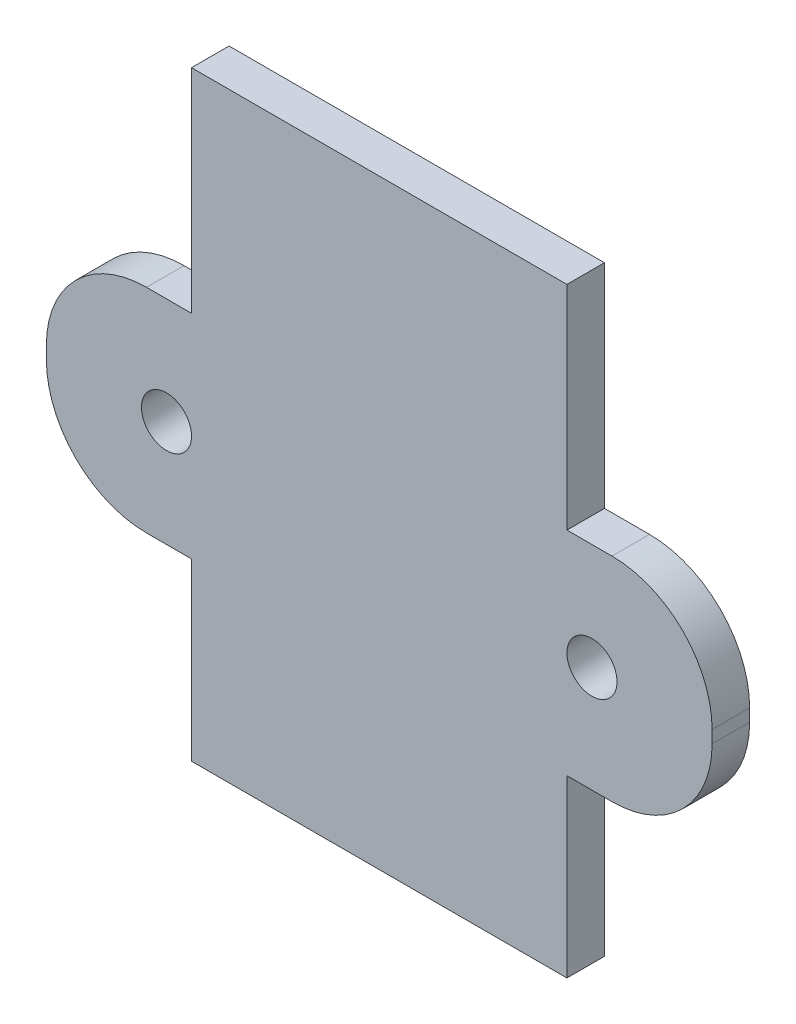
ISO-10303-21;
HEADER;
FILE_DESCRIPTION(('STEP AP214'),'2;1');
FILE_NAME('part.step','',(''),(''),'','','');
FILE_SCHEMA(('AUTOMOTIVE_DESIGN { 1 0 10303 214 1 1 1 1 }'));
ENDSEC;
DATA;
#1=APPLICATION_CONTEXT('core data for automotive mechanical design processes');
#2=APPLICATION_PROTOCOL_DEFINITION('international standard','automotive_design',2000,#1);
#3=PRODUCT_CONTEXT('',#1,'mechanical');
#4=PRODUCT('Part','Part','',(#3));
#5=PRODUCT_RELATED_PRODUCT_CATEGORY('part','',(#4));
#6=PRODUCT_DEFINITION_FORMATION('','',#4);
#7=PRODUCT_DEFINITION_CONTEXT('part definition',#1,'design');
#8=PRODUCT_DEFINITION('design','',#6,#7);
#9=PRODUCT_DEFINITION_SHAPE('','',#8);
#10=(LENGTH_UNIT() NAMED_UNIT(*) SI_UNIT(.MILLI.,.METRE.));
#11=(NAMED_UNIT(*) PLANE_ANGLE_UNIT() SI_UNIT($,.RADIAN.));
#12=(NAMED_UNIT(*) SI_UNIT($,.STERADIAN.) SOLID_ANGLE_UNIT());
#13=UNCERTAINTY_MEASURE_WITH_UNIT(LENGTH_MEASURE(1.E-05),#10,'distance_accuracy_value','');
#14=(GEOMETRIC_REPRESENTATION_CONTEXT(3) GLOBAL_UNCERTAINTY_ASSIGNED_CONTEXT((#13)) GLOBAL_UNIT_ASSIGNED_CONTEXT((#10,
#11,#12)) REPRESENTATION_CONTEXT('',''));
#15=CARTESIAN_POINT('',(0.,0.,0.));
#16=DIRECTION('',(0.,0.,1.));
#17=DIRECTION('',(1.,0.,0.));
#18=AXIS2_PLACEMENT_3D('',#15,#16,#17);
#19=CARTESIAN_POINT('',(-23.838175931887,-1.04784341461353,1.5));
#20=DIRECTION('',(0.,0.,-1.));
#21=DIRECTION('',(-1.,0.,0.));
#22=AXIS2_PLACEMENT_3D('',#19,#20,#21);
#23=CYLINDRICAL_SURFACE('',#22,4.);
#24=CARTESIAN_POINT('',(-23.838175931887,-1.04784341461353,0.));
#25=DIRECTION('',(0.,0.,1.));
#26=DIRECTION('',(1.,0.,0.));
#27=AXIS2_PLACEMENT_3D('',#24,#25,#26);
#28=CIRCLE('',#27,4.);
#29=CARTESIAN_POINT('',(-19.838175931887,-1.04784341461353,0.));
#30=VERTEX_POINT('',#29);
#31=CARTESIAN_POINT('',(-23.838175931887,-5.04784341461353,0.));
#32=VERTEX_POINT('',#31);
#33=EDGE_CURVE('E183',#30,#32,#28,.F.);
#34=ORIENTED_EDGE('',*,*,#33,.F.);
#35=DIRECTION('',(0.,0.,-1.));
#36=VECTOR('',#35,1.);
#37=CARTESIAN_POINT('',(-19.838175931887,-1.04784341461353,1.5));
#38=LINE('',#37,#36);
#39=CARTESIAN_POINT('',(-19.838175931887,-1.04784341461353,1.5));
#40=VERTEX_POINT('',#39);
#41=EDGE_CURVE('E11',#40,#30,#38,.T.);
#42=ORIENTED_EDGE('',*,*,#41,.F.);
#43=CARTESIAN_POINT('',(-23.838175931887,-1.04784341461353,1.5));
#44=DIRECTION('',(0.,0.,1.));
#45=DIRECTION('',(1.,0.,0.));
#46=AXIS2_PLACEMENT_3D('',#43,#44,#45);
#47=CIRCLE('',#46,4.);
#48=CARTESIAN_POINT('',(-23.838175931887,-5.04784341461353,1.5));
#49=VERTEX_POINT('',#48);
#50=EDGE_CURVE('E228',#40,#49,#47,.F.);
#51=ORIENTED_EDGE('',*,*,#50,.T.);
#52=DIRECTION('',(0.,0.,-1.));
#53=VECTOR('',#52,1.);
#54=CARTESIAN_POINT('',(-23.838175931887,-5.04784341461353,1.5));
#55=LINE('',#54,#53);
#56=EDGE_CURVE('E50',#49,#32,#55,.T.);
#57=ORIENTED_EDGE('',*,*,#56,.T.);
#58=EDGE_LOOP('',(#34,#42,#51,#57));
#59=FACE_BOUND('',#58,.T.);
#60=ADVANCED_FACE('F34',(#59),#23,.T.);
#61=CARTESIAN_POINT('',(-19.838175931887,0.,1.5));
#62=DIRECTION('',(-1.,0.,0.));
#63=DIRECTION('',(0.,0.,1.));
#64=AXIS2_PLACEMENT_3D('',#61,#62,#63);
#65=PLANE('',#64);
#66=DIRECTION('',(0.,1.,0.));
#67=VECTOR('',#66,1.);
#68=CARTESIAN_POINT('',(-19.838175931887,0.,0.));
#69=LINE('',#68,#67);
#70=CARTESIAN_POINT('',(-19.838175931887,-0.547843414613534,0.));
#71=VERTEX_POINT('',#70);
#72=EDGE_CURVE('E185',#30,#71,#69,.T.);
#73=ORIENTED_EDGE('',*,*,#72,.T.);
#74=DIRECTION('',(0.,0.,-1.));
#75=VECTOR('',#74,1.);
#76=CARTESIAN_POINT('',(-19.838175931887,-0.547843414613534,1.5));
#77=LINE('',#76,#75);
#78=CARTESIAN_POINT('',(-19.838175931887,-0.547843414613534,1.5));
#79=VERTEX_POINT('',#78);
#80=EDGE_CURVE('E42',#79,#71,#77,.T.);
#81=ORIENTED_EDGE('',*,*,#80,.F.);
#82=DIRECTION('',(0.,1.,0.));
#83=VECTOR('',#82,1.);
#84=CARTESIAN_POINT('',(-19.838175931887,0.,1.5));
#85=LINE('',#84,#83);
#86=EDGE_CURVE('E277',#40,#79,#85,.T.);
#87=ORIENTED_EDGE('',*,*,#86,.F.);
#88=ORIENTED_EDGE('',*,*,#41,.T.);
#89=EDGE_LOOP('',(#73,#81,#87,#88));
#90=FACE_BOUND('',#89,.T.);
#91=ADVANCED_FACE('F264',(#90),#65,.F.);
#92=CARTESIAN_POINT('',(-23.838175931887,-0.547843414613534,1.5));
#93=DIRECTION('',(0.,0.,-1.));
#94=DIRECTION('',(-1.,0.,0.));
#95=AXIS2_PLACEMENT_3D('',#92,#93,#94);
#96=CYLINDRICAL_SURFACE('',#95,4.);
#97=CARTESIAN_POINT('',(-23.838175931887,-0.547843414613534,0.));
#98=DIRECTION('',(0.,0.,1.));
#99=DIRECTION('',(1.,0.,0.));
#100=AXIS2_PLACEMENT_3D('',#97,#98,#99);
#101=CIRCLE('',#100,4.);
#102=CARTESIAN_POINT('',(-23.838175931887,3.45215658538647,0.));
#103=VERTEX_POINT('',#102);
#104=EDGE_CURVE('E188',#103,#71,#101,.F.);
#105=ORIENTED_EDGE('',*,*,#104,.F.);
#106=DIRECTION('',(0.,0.,-1.));
#107=VECTOR('',#106,1.);
#108=CARTESIAN_POINT('',(-23.838175931887,3.45215658538647,1.5));
#109=LINE('',#108,#107);
#110=CARTESIAN_POINT('',(-23.838175931887,3.45215658538647,1.5));
#111=VERTEX_POINT('',#110);
#112=EDGE_CURVE('E254',#111,#103,#109,.T.);
#113=ORIENTED_EDGE('',*,*,#112,.F.);
#114=CARTESIAN_POINT('',(-23.838175931887,-0.547843414613534,1.5));
#115=DIRECTION('',(0.,0.,1.));
#116=DIRECTION('',(1.,0.,0.));
#117=AXIS2_PLACEMENT_3D('',#114,#115,#116);
#118=CIRCLE('',#117,4.);
#119=EDGE_CURVE('E261',#111,#79,#118,.F.);
#120=ORIENTED_EDGE('',*,*,#119,.T.);
#121=ORIENTED_EDGE('',*,*,#80,.T.);
#122=EDGE_LOOP('',(#105,#113,#120,#121));
#123=FACE_BOUND('',#122,.T.);
#124=ADVANCED_FACE('F259',(#123),#96,.T.);
#125=CARTESIAN_POINT('',(0.,3.45215658538647,1.5));
#126=DIRECTION('',(0.,1.,0.));
#127=DIRECTION('',(0.,0.,1.));
#128=AXIS2_PLACEMENT_3D('',#125,#126,#127);
#129=PLANE('',#128);
#130=DIRECTION('',(1.,0.,0.));
#131=VECTOR('',#130,1.);
#132=CARTESIAN_POINT('',(0.,3.45215658538647,0.));
#133=LINE('',#132,#131);
#134=CARTESIAN_POINT('',(-25.638175931887,3.45215658538647,0.));
#135=VERTEX_POINT('',#134);
#136=EDGE_CURVE('E191',#135,#103,#133,.T.);
#137=ORIENTED_EDGE('',*,*,#136,.F.);
#138=DIRECTION('',(0.,0.,-1.));
#139=VECTOR('',#138,1.);
#140=CARTESIAN_POINT('',(-25.638175931887,3.45215658538647,1.5));
#141=LINE('',#140,#139);
#142=CARTESIAN_POINT('',(-25.638175931887,3.45215658538647,1.5));
#143=VERTEX_POINT('',#142);
#144=EDGE_CURVE('E252',#143,#135,#141,.T.);
#145=ORIENTED_EDGE('',*,*,#144,.F.);
#146=DIRECTION('',(1.,0.,0.));
#147=VECTOR('',#146,1.);
#148=CARTESIAN_POINT('',(0.,3.45215658538647,1.5));
#149=LINE('',#148,#147);
#150=EDGE_CURVE('E274',#143,#111,#149,.T.);
#151=ORIENTED_EDGE('',*,*,#150,.T.);
#152=ORIENTED_EDGE('',*,*,#112,.T.);
#153=EDGE_LOOP('',(#137,#145,#151,#152));
#154=FACE_BOUND('',#153,.T.);
#155=ADVANCED_FACE('F271',(#154),#129,.T.);
#156=CARTESIAN_POINT('',(-25.638175931887,0.,1.5));
#157=DIRECTION('',(1.,0.,0.));
#158=DIRECTION('',(0.,0.,-1.));
#159=AXIS2_PLACEMENT_3D('',#156,#157,#158);
#160=PLANE('',#159);
#161=DIRECTION('',(0.,-1.,0.));
#162=VECTOR('',#161,1.);
#163=CARTESIAN_POINT('',(-25.638175931887,0.,0.));
#164=LINE('',#163,#162);
#165=CARTESIAN_POINT('',(-25.638175931887,11.9521565853865,0.));
#166=VERTEX_POINT('',#165);
#167=EDGE_CURVE('E194',#166,#135,#164,.T.);
#168=ORIENTED_EDGE('',*,*,#167,.F.);
#169=DIRECTION('',(0.,0.,-1.));
#170=VECTOR('',#169,1.);
#171=CARTESIAN_POINT('',(-25.638175931887,11.9521565853865,1.5));
#172=LINE('',#171,#170);
#173=CARTESIAN_POINT('',(-25.638175931887,11.9521565853865,1.5));
#174=VERTEX_POINT('',#173);
#175=EDGE_CURVE('E250',#174,#166,#172,.T.);
#176=ORIENTED_EDGE('',*,*,#175,.F.);
#177=DIRECTION('',(0.,-1.,0.));
#178=VECTOR('',#177,1.);
#179=CARTESIAN_POINT('',(-25.638175931887,0.,1.5));
#180=LINE('',#179,#178);
#181=EDGE_CURVE('E279',#174,#143,#180,.T.);
#182=ORIENTED_EDGE('',*,*,#181,.T.);
#183=ORIENTED_EDGE('',*,*,#144,.T.);
#184=EDGE_LOOP('',(#168,#176,#182,#183));
#185=FACE_BOUND('',#184,.T.);
#186=ADVANCED_FACE('F336',(#185),#160,.T.);
#187=CARTESIAN_POINT('',(0.,11.9521565853865,1.5));
#188=DIRECTION('',(0.,1.,0.));
#189=DIRECTION('',(0.,0.,1.));
#190=AXIS2_PLACEMENT_3D('',#187,#188,#189);
#191=PLANE('',#190);
#192=DIRECTION('',(1.,0.,0.));
#193=VECTOR('',#192,1.);
#194=CARTESIAN_POINT('',(0.,11.9521565853865,0.));
#195=LINE('',#194,#193);
#196=CARTESIAN_POINT('',(-40.638175931887,11.9521565853865,0.));
#197=VERTEX_POINT('',#196);
#198=EDGE_CURVE('E197',#197,#166,#195,.T.);
#199=ORIENTED_EDGE('',*,*,#198,.F.);
#200=DIRECTION('',(0.,0.,-1.));
#201=VECTOR('',#200,1.);
#202=CARTESIAN_POINT('',(-40.638175931887,11.9521565853865,1.5));
#203=LINE('',#202,#201);
#204=CARTESIAN_POINT('',(-40.638175931887,11.9521565853865,1.5));
#205=VERTEX_POINT('',#204);
#206=EDGE_CURVE('E248',#205,#197,#203,.T.);
#207=ORIENTED_EDGE('',*,*,#206,.F.);
#208=DIRECTION('',(1.,0.,0.));
#209=VECTOR('',#208,1.);
#210=CARTESIAN_POINT('',(0.,11.9521565853865,1.5));
#211=LINE('',#210,#209);
#212=EDGE_CURVE('E285',#205,#174,#211,.T.);
#213=ORIENTED_EDGE('',*,*,#212,.T.);
#214=ORIENTED_EDGE('',*,*,#175,.T.);
#215=EDGE_LOOP('',(#199,#207,#213,#214));
#216=FACE_BOUND('',#215,.T.);
#217=ADVANCED_FACE('F339',(#216),#191,.T.);
#218=CARTESIAN_POINT('',(-40.638175931887,0.,1.5));
#219=DIRECTION('',(1.,0.,0.));
#220=DIRECTION('',(0.,0.,-1.));
#221=AXIS2_PLACEMENT_3D('',#218,#219,#220);
#222=PLANE('',#221);
#223=DIRECTION('',(0.,-1.,0.));
#224=VECTOR('',#223,1.);
#225=CARTESIAN_POINT('',(-40.638175931887,0.,0.));
#226=LINE('',#225,#224);
#227=CARTESIAN_POINT('',(-40.638175931887,3.45215658538647,0.));
#228=VERTEX_POINT('',#227);
#229=EDGE_CURVE('E200',#197,#228,#226,.T.);
#230=ORIENTED_EDGE('',*,*,#229,.T.);
#231=DIRECTION('',(0.,0.,-1.));
#232=VECTOR('',#231,1.);
#233=CARTESIAN_POINT('',(-40.638175931887,3.45215658538647,1.5));
#234=LINE('',#233,#232);
#235=CARTESIAN_POINT('',(-40.638175931887,3.45215658538647,1.5));
#236=VERTEX_POINT('',#235);
#237=EDGE_CURVE('E245',#236,#228,#234,.T.);
#238=ORIENTED_EDGE('',*,*,#237,.F.);
#239=DIRECTION('',(0.,-1.,0.));
#240=VECTOR('',#239,1.);
#241=CARTESIAN_POINT('',(-40.638175931887,0.,1.5));
#242=LINE('',#241,#240);
#243=EDGE_CURVE('E288',#205,#236,#242,.T.);
#244=ORIENTED_EDGE('',*,*,#243,.F.);
#245=ORIENTED_EDGE('',*,*,#206,.T.);
#246=EDGE_LOOP('',(#230,#238,#244,#245));
#247=FACE_BOUND('',#246,.T.);
#248=ADVANCED_FACE('F343',(#247),#222,.F.);
#249=CARTESIAN_POINT('',(0.,3.45215658538647,1.5));
#250=DIRECTION('',(0.,-1.,0.));
#251=DIRECTION('',(0.,0.,-1.));
#252=AXIS2_PLACEMENT_3D('',#249,#250,#251);
#253=PLANE('',#252);
#254=DIRECTION('',(-1.,0.,0.));
#255=VECTOR('',#254,1.);
#256=CARTESIAN_POINT('',(0.,3.45215658538647,0.));
#257=LINE('',#256,#255);
#258=CARTESIAN_POINT('',(-42.438175931887,3.45215658538647,0.));
#259=VERTEX_POINT('',#258);
#260=EDGE_CURVE('E202',#228,#259,#257,.T.);
#261=ORIENTED_EDGE('',*,*,#260,.T.);
#262=DIRECTION('',(0.,0.,-1.));
#263=VECTOR('',#262,1.);
#264=CARTESIAN_POINT('',(-42.438175931887,3.45215658538647,1.5));
#265=LINE('',#264,#263);
#266=CARTESIAN_POINT('',(-42.438175931887,3.45215658538647,1.5));
#267=VERTEX_POINT('',#266);
#268=EDGE_CURVE('E242',#267,#259,#265,.T.);
#269=ORIENTED_EDGE('',*,*,#268,.F.);
#270=DIRECTION('',(-1.,0.,0.));
#271=VECTOR('',#270,1.);
#272=CARTESIAN_POINT('',(0.,3.45215658538647,1.5));
#273=LINE('',#272,#271);
#274=EDGE_CURVE('E290',#236,#267,#273,.T.);
#275=ORIENTED_EDGE('',*,*,#274,.F.);
#276=ORIENTED_EDGE('',*,*,#237,.T.);
#277=EDGE_LOOP('',(#261,#269,#275,#276));
#278=FACE_BOUND('',#277,.T.);
#279=ADVANCED_FACE('F347',(#278),#253,.F.);
#280=CARTESIAN_POINT('',(-42.438175931887,-0.547843414613534,1.5));
#281=DIRECTION('',(0.,0.,-1.));
#282=DIRECTION('',(-1.,0.,0.));
#283=AXIS2_PLACEMENT_3D('',#280,#281,#282);
#284=CYLINDRICAL_SURFACE('',#283,4.);
#285=CARTESIAN_POINT('',(-42.438175931887,-0.547843414613534,0.));
#286=DIRECTION('',(0.,0.,1.));
#287=DIRECTION('',(1.,0.,0.));
#288=AXIS2_PLACEMENT_3D('',#285,#286,#287);
#289=CIRCLE('',#288,4.);
#290=CARTESIAN_POINT('',(-46.438175931887,-0.547843414613534,0.));
#291=VERTEX_POINT('',#290);
#292=EDGE_CURVE('E204',#259,#291,#289,.T.);
#293=ORIENTED_EDGE('',*,*,#292,.T.);
#294=DIRECTION('',(0.,0.,-1.));
#295=VECTOR('',#294,1.);
#296=CARTESIAN_POINT('',(-46.438175931887,-0.547843414613534,1.5));
#297=LINE('',#296,#295);
#298=CARTESIAN_POINT('',(-46.438175931887,-0.547843414613534,1.5));
#299=VERTEX_POINT('',#298);
#300=EDGE_CURVE('E240',#299,#291,#297,.T.);
#301=ORIENTED_EDGE('',*,*,#300,.F.);
#302=CARTESIAN_POINT('',(-42.438175931887,-0.547843414613534,1.5));
#303=DIRECTION('',(0.,0.,1.));
#304=DIRECTION('',(1.,0.,0.));
#305=AXIS2_PLACEMENT_3D('',#302,#303,#304);
#306=CIRCLE('',#305,4.);
#307=EDGE_CURVE('E292',#267,#299,#306,.T.);
#308=ORIENTED_EDGE('',*,*,#307,.F.);
#309=ORIENTED_EDGE('',*,*,#268,.T.);
#310=EDGE_LOOP('',(#293,#301,#308,#309));
#311=FACE_BOUND('',#310,.T.);
#312=ADVANCED_FACE('F351',(#311),#284,.T.);
#313=CARTESIAN_POINT('',(-46.438175931887,0.,1.5));
#314=DIRECTION('',(-1.,0.,0.));
#315=DIRECTION('',(0.,0.,1.));
#316=AXIS2_PLACEMENT_3D('',#313,#314,#315);
#317=PLANE('',#316);
#318=DIRECTION('',(0.,1.,0.));
#319=VECTOR('',#318,1.);
#320=CARTESIAN_POINT('',(-46.438175931887,0.,0.));
#321=LINE('',#320,#319);
#322=CARTESIAN_POINT('',(-46.438175931887,-1.04784341461353,0.));
#323=VERTEX_POINT('',#322);
#324=EDGE_CURVE('E207',#323,#291,#321,.T.);
#325=ORIENTED_EDGE('',*,*,#324,.F.);
#326=DIRECTION('',(0.,0.,-1.));
#327=VECTOR('',#326,1.);
#328=CARTESIAN_POINT('',(-46.438175931887,-1.04784341461353,1.5));
#329=LINE('',#328,#327);
#330=CARTESIAN_POINT('',(-46.438175931887,-1.04784341461353,1.5));
#331=VERTEX_POINT('',#330);
#332=EDGE_CURVE('E238',#331,#323,#329,.T.);
#333=ORIENTED_EDGE('',*,*,#332,.F.);
#334=DIRECTION('',(0.,1.,0.));
#335=VECTOR('',#334,1.);
#336=CARTESIAN_POINT('',(-46.438175931887,0.,1.5));
#337=LINE('',#336,#335);
#338=EDGE_CURVE('E294',#331,#299,#337,.T.);
#339=ORIENTED_EDGE('',*,*,#338,.T.);
#340=ORIENTED_EDGE('',*,*,#300,.T.);
#341=EDGE_LOOP('',(#325,#333,#339,#340));
#342=FACE_BOUND('',#341,.T.);
#343=ADVANCED_FACE('F355',(#342),#317,.T.);
#344=CARTESIAN_POINT('',(-42.438175931887,-1.04784341461353,1.5));
#345=DIRECTION('',(0.,0.,-1.));
#346=DIRECTION('',(-1.,0.,0.));
#347=AXIS2_PLACEMENT_3D('',#344,#345,#346);
#348=CYLINDRICAL_SURFACE('',#347,4.);
#349=CARTESIAN_POINT('',(-42.438175931887,-1.04784341461353,0.));
#350=DIRECTION('',(0.,0.,1.));
#351=DIRECTION('',(1.,0.,0.));
#352=AXIS2_PLACEMENT_3D('',#349,#350,#351);
#353=CIRCLE('',#352,4.);
#354=CARTESIAN_POINT('',(-42.438175931887,-5.04784341461353,0.));
#355=VERTEX_POINT('',#354);
#356=EDGE_CURVE('E210',#323,#355,#353,.T.);
#357=ORIENTED_EDGE('',*,*,#356,.T.);
#358=DIRECTION('',(0.,0.,-1.));
#359=VECTOR('',#358,1.);
#360=CARTESIAN_POINT('',(-42.438175931887,-5.04784341461353,1.5));
#361=LINE('',#360,#359);
#362=CARTESIAN_POINT('',(-42.438175931887,-5.04784341461353,1.5));
#363=VERTEX_POINT('',#362);
#364=EDGE_CURVE('E235',#363,#355,#361,.T.);
#365=ORIENTED_EDGE('',*,*,#364,.F.);
#366=CARTESIAN_POINT('',(-42.438175931887,-1.04784341461353,1.5));
#367=DIRECTION('',(0.,0.,1.));
#368=DIRECTION('',(1.,0.,0.));
#369=AXIS2_PLACEMENT_3D('',#366,#367,#368);
#370=CIRCLE('',#369,4.);
#371=EDGE_CURVE('E297',#331,#363,#370,.T.);
#372=ORIENTED_EDGE('',*,*,#371,.F.);
#373=ORIENTED_EDGE('',*,*,#332,.T.);
#374=EDGE_LOOP('',(#357,#365,#372,#373));
#375=FACE_BOUND('',#374,.T.);
#376=ADVANCED_FACE('F359',(#375),#348,.T.);
#377=CARTESIAN_POINT('',(0.,-5.04784341461353,1.5));
#378=DIRECTION('',(0.,1.,0.));
#379=DIRECTION('',(0.,0.,1.));
#380=AXIS2_PLACEMENT_3D('',#377,#378,#379);
#381=PLANE('',#380);
#382=DIRECTION('',(1.,0.,0.));
#383=VECTOR('',#382,1.);
#384=CARTESIAN_POINT('',(0.,-5.04784341461353,0.));
#385=LINE('',#384,#383);
#386=CARTESIAN_POINT('',(-40.638175931887,-5.04784341461353,0.));
#387=VERTEX_POINT('',#386);
#388=EDGE_CURVE('E212',#355,#387,#385,.T.);
#389=ORIENTED_EDGE('',*,*,#388,.T.);
#390=DIRECTION('',(0.,0.,-1.));
#391=VECTOR('',#390,1.);
#392=CARTESIAN_POINT('',(-40.638175931887,-5.04784341461353,1.5));
#393=LINE('',#392,#391);
#394=CARTESIAN_POINT('',(-40.638175931887,-5.04784341461353,1.5));
#395=VERTEX_POINT('',#394);
#396=EDGE_CURVE('E232',#395,#387,#393,.T.);
#397=ORIENTED_EDGE('',*,*,#396,.F.);
#398=DIRECTION('',(1.,0.,0.));
#399=VECTOR('',#398,1.);
#400=CARTESIAN_POINT('',(0.,-5.04784341461353,1.5));
#401=LINE('',#400,#399);
#402=EDGE_CURVE('E299',#363,#395,#401,.T.);
#403=ORIENTED_EDGE('',*,*,#402,.F.);
#404=ORIENTED_EDGE('',*,*,#364,.T.);
#405=EDGE_LOOP('',(#389,#397,#403,#404));
#406=FACE_BOUND('',#405,.T.);
#407=ADVANCED_FACE('F306',(#406),#381,.F.);
#408=CARTESIAN_POINT('',(-40.638175931887,0.,1.5));
#409=DIRECTION('',(1.,0.,0.));
#410=DIRECTION('',(0.,0.,-1.));
#411=AXIS2_PLACEMENT_3D('',#408,#409,#410);
#412=PLANE('',#411);
#413=DIRECTION('',(0.,-1.,0.));
#414=VECTOR('',#413,1.);
#415=CARTESIAN_POINT('',(-40.638175931887,0.,0.));
#416=LINE('',#415,#414);
#417=CARTESIAN_POINT('',(-40.638175931887,-12.0478434146135,0.));
#418=VERTEX_POINT('',#417);
#419=EDGE_CURVE('E214',#387,#418,#416,.T.);
#420=ORIENTED_EDGE('',*,*,#419,.T.);
#421=DIRECTION('',(0.,0.,-1.));
#422=VECTOR('',#421,1.);
#423=CARTESIAN_POINT('',(-40.638175931887,-12.0478434146135,1.5));
#424=LINE('',#423,#422);
#425=CARTESIAN_POINT('',(-40.638175931887,-12.0478434146135,1.5));
#426=VERTEX_POINT('',#425);
#427=EDGE_CURVE('E169',#426,#418,#424,.T.);
#428=ORIENTED_EDGE('',*,*,#427,.F.);
#429=DIRECTION('',(0.,-1.,0.));
#430=VECTOR('',#429,1.);
#431=CARTESIAN_POINT('',(-40.638175931887,0.,1.5));
#432=LINE('',#431,#430);
#433=EDGE_CURVE('E157',#395,#426,#432,.T.);
#434=ORIENTED_EDGE('',*,*,#433,.F.);
#435=ORIENTED_EDGE('',*,*,#396,.T.);
#436=EDGE_LOOP('',(#420,#428,#434,#435));
#437=FACE_BOUND('',#436,.T.);
#438=ADVANCED_FACE('F310',(#437),#412,.F.);
#439=CARTESIAN_POINT('',(0.,-12.0478434146135,1.5));
#440=DIRECTION('',(0.,1.,0.));
#441=DIRECTION('',(0.,0.,1.));
#442=AXIS2_PLACEMENT_3D('',#439,#440,#441);
#443=PLANE('',#442);
#444=DIRECTION('',(1.,0.,0.));
#445=VECTOR('',#444,1.);
#446=CARTESIAN_POINT('',(0.,-12.0478434146135,0.));
#447=LINE('',#446,#445);
#448=CARTESIAN_POINT('',(-25.638175931887,-12.0478434146135,0.));
#449=VERTEX_POINT('',#448);
#450=EDGE_CURVE('E166',#418,#449,#447,.T.);
#451=ORIENTED_EDGE('',*,*,#450,.T.);
#452=DIRECTION('',(0.,0.,-1.));
#453=VECTOR('',#452,1.);
#454=CARTESIAN_POINT('',(-25.638175931887,-12.0478434146135,1.5));
#455=LINE('',#454,#453);
#456=CARTESIAN_POINT('',(-25.638175931887,-12.0478434146135,1.5));
#457=VERTEX_POINT('',#456);
#458=EDGE_CURVE('E163',#457,#449,#455,.T.);
#459=ORIENTED_EDGE('',*,*,#458,.F.);
#460=DIRECTION('',(1.,0.,0.));
#461=VECTOR('',#460,1.);
#462=CARTESIAN_POINT('',(0.,-12.0478434146135,1.5));
#463=LINE('',#462,#461);
#464=EDGE_CURVE('E148',#426,#457,#463,.T.);
#465=ORIENTED_EDGE('',*,*,#464,.F.);
#466=ORIENTED_EDGE('',*,*,#427,.T.);
#467=EDGE_LOOP('',(#451,#459,#465,#466));
#468=FACE_BOUND('',#467,.T.);
#469=ADVANCED_FACE('F164',(#468),#443,.F.);
#470=CARTESIAN_POINT('',(-25.638175931887,0.,1.5));
#471=DIRECTION('',(1.,0.,0.));
#472=DIRECTION('',(0.,0.,-1.));
#473=AXIS2_PLACEMENT_3D('',#470,#471,#472);
#474=PLANE('',#473);
#475=DIRECTION('',(0.,-1.,0.));
#476=VECTOR('',#475,1.);
#477=CARTESIAN_POINT('',(-25.638175931887,0.,0.));
#478=LINE('',#477,#476);
#479=CARTESIAN_POINT('',(-25.638175931887,-5.04784341461353,0.));
#480=VERTEX_POINT('',#479);
#481=EDGE_CURVE('E217',#480,#449,#478,.T.);
#482=ORIENTED_EDGE('',*,*,#481,.F.);
#483=DIRECTION('',(0.,0.,-1.));
#484=VECTOR('',#483,1.);
#485=CARTESIAN_POINT('',(-25.638175931887,-5.04784341461353,1.5));
#486=LINE('',#485,#484);
#487=CARTESIAN_POINT('',(-25.638175931887,-5.04784341461353,1.5));
#488=VERTEX_POINT('',#487);
#489=EDGE_CURVE('E99',#488,#480,#486,.T.);
#490=ORIENTED_EDGE('',*,*,#489,.F.);
#491=DIRECTION('',(0.,-1.,0.));
#492=VECTOR('',#491,1.);
#493=CARTESIAN_POINT('',(-25.638175931887,0.,1.5));
#494=LINE('',#493,#492);
#495=EDGE_CURVE('E155',#488,#457,#494,.T.);
#496=ORIENTED_EDGE('',*,*,#495,.T.);
#497=ORIENTED_EDGE('',*,*,#458,.T.);
#498=EDGE_LOOP('',(#482,#490,#496,#497));
#499=FACE_BOUND('',#498,.T.);
#500=ADVANCED_FACE('F171',(#499),#474,.T.);
#501=CARTESIAN_POINT('',(-41.638175931887,-0.797843414613534,1.5));
#502=DIRECTION('',(0.,0.,-1.));
#503=DIRECTION('',(-1.,0.,0.));
#504=AXIS2_PLACEMENT_3D('',#501,#502,#503);
#505=CYLINDRICAL_SURFACE('',#504,0.999999999999998);
#506=CARTESIAN_POINT('',(-41.638175931887,-0.797843414613534,1.5));
#507=DIRECTION('',(0.,0.,1.));
#508=DIRECTION('',(1.,0.,0.));
#509=AXIS2_PLACEMENT_3D('',#506,#507,#508);
#510=CIRCLE('',#509,0.999999999999998);
#511=CARTESIAN_POINT('',(-40.638175931887,-0.797843414613534,1.5));
#512=VERTEX_POINT('',#511);
#513=EDGE_CURVE('E174',#512,#512,#510,.T.);
#514=ORIENTED_EDGE('',*,*,#513,.T.);
#515=EDGE_LOOP('',(#514));
#516=FACE_BOUND('',#515,.T.);
#517=CARTESIAN_POINT('',(-41.638175931887,-0.797843414613534,0.));
#518=DIRECTION('',(0.,0.,1.));
#519=DIRECTION('',(1.,0.,0.));
#520=AXIS2_PLACEMENT_3D('',#517,#518,#519);
#521=CIRCLE('',#520,0.999999999999998);
#522=CARTESIAN_POINT('',(-40.638175931887,-0.797843414613534,0.));
#523=VERTEX_POINT('',#522);
#524=EDGE_CURVE('E222',#523,#523,#521,.T.);
#525=ORIENTED_EDGE('',*,*,#524,.F.);
#526=EDGE_LOOP('',(#525));
#527=FACE_BOUND('',#526,.T.);
#528=ADVANCED_FACE('F314',(#516,#527),#505,.F.);
#529=CARTESIAN_POINT('',(0.,-5.04784341461353,1.5));
#530=DIRECTION('',(0.,-1.,0.));
#531=DIRECTION('',(0.,0.,-1.));
#532=AXIS2_PLACEMENT_3D('',#529,#530,#531);
#533=PLANE('',#532);
#534=DIRECTION('',(-1.,0.,0.));
#535=VECTOR('',#534,1.);
#536=CARTESIAN_POINT('',(0.,-5.04784341461353,0.));
#537=LINE('',#536,#535);
#538=EDGE_CURVE('E219',#32,#480,#537,.T.);
#539=ORIENTED_EDGE('',*,*,#538,.F.);
#540=ORIENTED_EDGE('',*,*,#56,.F.);
#541=DIRECTION('',(-1.,0.,0.));
#542=VECTOR('',#541,1.);
#543=CARTESIAN_POINT('',(0.,-5.04784341461353,1.5));
#544=LINE('',#543,#542);
#545=EDGE_CURVE('E172',#49,#488,#544,.T.);
#546=ORIENTED_EDGE('',*,*,#545,.T.);
#547=ORIENTED_EDGE('',*,*,#489,.T.);
#548=EDGE_LOOP('',(#539,#540,#546,#547));
#549=FACE_BOUND('',#548,.T.);
#550=ADVANCED_FACE('F311',(#549),#533,.T.);
#551=CARTESIAN_POINT('',(-24.638175931887,-0.797843414613534,1.5));
#552=DIRECTION('',(0.,0.,-1.));
#553=DIRECTION('',(-1.,0.,0.));
#554=AXIS2_PLACEMENT_3D('',#551,#552,#553);
#555=CYLINDRICAL_SURFACE('',#554,0.999999999999998);
#556=CARTESIAN_POINT('',(-24.638175931887,-0.797843414613534,1.5));
#557=DIRECTION('',(0.,0.,1.));
#558=DIRECTION('',(1.,0.,0.));
#559=AXIS2_PLACEMENT_3D('',#556,#557,#558);
#560=CIRCLE('',#559,0.999999999999998);
#561=CARTESIAN_POINT('',(-23.638175931887,-0.797843414613534,1.5));
#562=VERTEX_POINT('',#561);
#563=EDGE_CURVE('E180',#562,#562,#560,.F.);
#564=ORIENTED_EDGE('',*,*,#563,.F.);
#565=EDGE_LOOP('',(#564));
#566=FACE_BOUND('',#565,.T.);
#567=CARTESIAN_POINT('',(-24.638175931887,-0.797843414613534,0.));
#568=DIRECTION('',(0.,0.,1.));
#569=DIRECTION('',(1.,0.,0.));
#570=AXIS2_PLACEMENT_3D('',#567,#568,#569);
#571=CIRCLE('',#570,0.999999999999998);
#572=CARTESIAN_POINT('',(-23.638175931887,-0.797843414613534,0.));
#573=VERTEX_POINT('',#572);
#574=EDGE_CURVE('E225',#573,#573,#571,.F.);
#575=ORIENTED_EDGE('',*,*,#574,.T.);
#576=EDGE_LOOP('',(#575));
#577=FACE_BOUND('',#576,.T.);
#578=ADVANCED_FACE('F313',(#566,#577),#555,.F.);
#579=CARTESIAN_POINT('',(0.,0.,1.5));
#580=DIRECTION('',(0.,0.,1.));
#581=DIRECTION('',(1.,0.,0.));
#582=AXIS2_PLACEMENT_3D('',#579,#580,#581);
#583=PLANE('',#582);
#584=ORIENTED_EDGE('',*,*,#50,.F.);
#585=ORIENTED_EDGE('',*,*,#86,.T.);
#586=ORIENTED_EDGE('',*,*,#119,.F.);
#587=ORIENTED_EDGE('',*,*,#150,.F.);
#588=ORIENTED_EDGE('',*,*,#181,.F.);
#589=ORIENTED_EDGE('',*,*,#212,.F.);
#590=ORIENTED_EDGE('',*,*,#243,.T.);
#591=ORIENTED_EDGE('',*,*,#274,.T.);
#592=ORIENTED_EDGE('',*,*,#307,.T.);
#593=ORIENTED_EDGE('',*,*,#338,.F.);
#594=ORIENTED_EDGE('',*,*,#371,.T.);
#595=ORIENTED_EDGE('',*,*,#402,.T.);
#596=ORIENTED_EDGE('',*,*,#433,.T.);
#597=ORIENTED_EDGE('',*,*,#464,.T.);
#598=ORIENTED_EDGE('',*,*,#495,.F.);
#599=ORIENTED_EDGE('',*,*,#545,.F.);
#600=EDGE_LOOP('',(#584,#585,#586,#587,#588,#589,#590,#591,#592,#593,#594,#595,#596,#597,#598,#599));
#601=FACE_BOUND('',#600,.T.);
#602=ORIENTED_EDGE('',*,*,#513,.F.);
#603=EDGE_LOOP('',(#602));
#604=FACE_BOUND('',#603,.T.);
#605=ORIENTED_EDGE('',*,*,#563,.T.);
#606=EDGE_LOOP('',(#605));
#607=FACE_BOUND('',#606,.T.);
#608=ADVANCED_FACE('F151',(#601,#604,#607),#583,.T.);
#609=CARTESIAN_POINT('',(0.,0.,0.));
#610=DIRECTION('',(0.,0.,1.));
#611=DIRECTION('',(1.,0.,0.));
#612=AXIS2_PLACEMENT_3D('',#609,#610,#611);
#613=PLANE('',#612);
#614=ORIENTED_EDGE('',*,*,#33,.T.);
#615=ORIENTED_EDGE('',*,*,#538,.T.);
#616=ORIENTED_EDGE('',*,*,#481,.T.);
#617=ORIENTED_EDGE('',*,*,#450,.F.);
#618=ORIENTED_EDGE('',*,*,#419,.F.);
#619=ORIENTED_EDGE('',*,*,#388,.F.);
#620=ORIENTED_EDGE('',*,*,#356,.F.);
#621=ORIENTED_EDGE('',*,*,#324,.T.);
#622=ORIENTED_EDGE('',*,*,#292,.F.);
#623=ORIENTED_EDGE('',*,*,#260,.F.);
#624=ORIENTED_EDGE('',*,*,#229,.F.);
#625=ORIENTED_EDGE('',*,*,#198,.T.);
#626=ORIENTED_EDGE('',*,*,#167,.T.);
#627=ORIENTED_EDGE('',*,*,#136,.T.);
#628=ORIENTED_EDGE('',*,*,#104,.T.);
#629=ORIENTED_EDGE('',*,*,#72,.F.);
#630=EDGE_LOOP('',(#614,#615,#616,#617,#618,#619,#620,#621,#622,#623,#624,#625,#626,#627,#628,#629));
#631=FACE_BOUND('',#630,.T.);
#632=ORIENTED_EDGE('',*,*,#524,.T.);
#633=EDGE_LOOP('',(#632));
#634=FACE_BOUND('',#633,.T.);
#635=ORIENTED_EDGE('',*,*,#574,.F.);
#636=EDGE_LOOP('',(#635));
#637=FACE_BOUND('',#636,.T.);
#638=ADVANCED_FACE('F266',(#631,#634,#637),#613,.F.);
#639=CLOSED_SHELL('',(#60,#91,#124,#155,#186,#217,#248,#279,#312,#343,#376,#407,#438,#469,#500,
#528,#550,#578,#608,#638));
#640=MANIFOLD_SOLID_BREP('B2',#639);
#641=ADVANCED_BREP_SHAPE_REPRESENTATION('',(#18,#640),#14);
#642=SHAPE_DEFINITION_REPRESENTATION(#9,#641);
ENDSEC;
END-ISO-10303-21;
